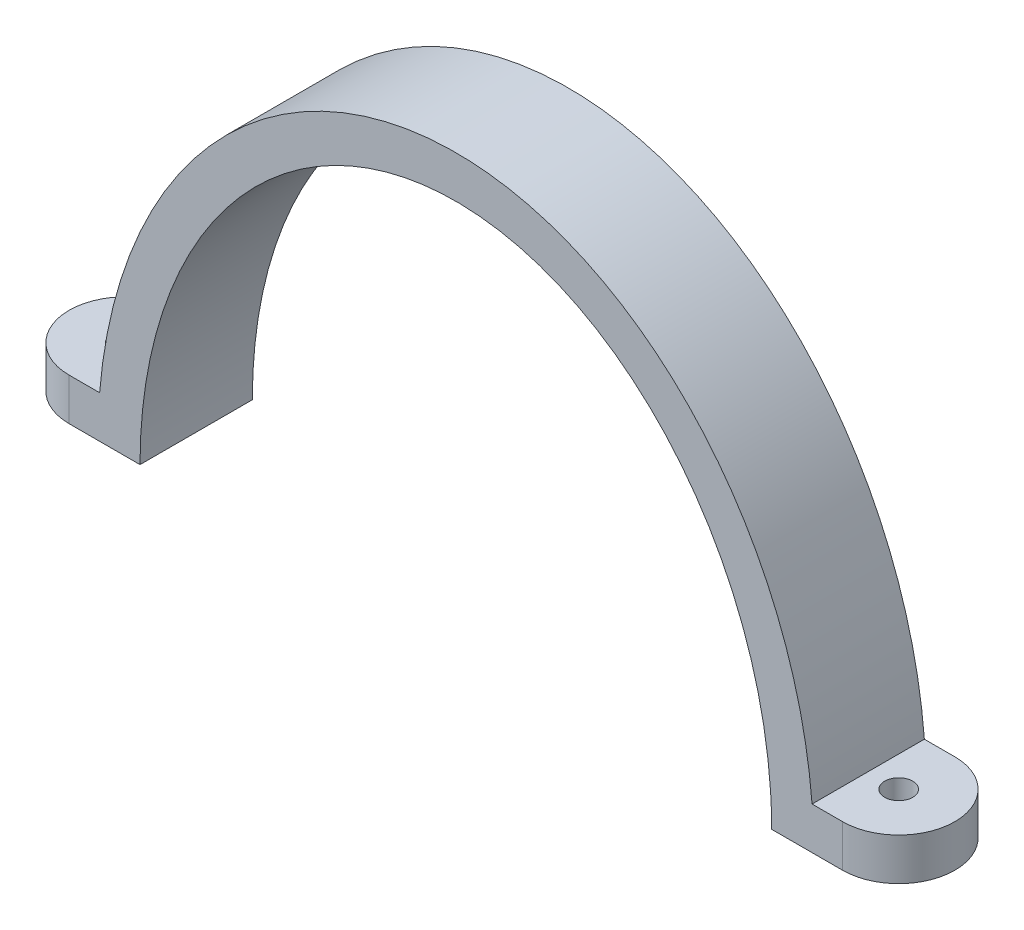
ISO-10303-21;
HEADER;
FILE_DESCRIPTION(('STEP AP214'),'2;1');
FILE_NAME('part.step','',(''),(''),'','','');
FILE_SCHEMA(('AUTOMOTIVE_DESIGN { 1 0 10303 214 1 1 1 1 }'));
ENDSEC;
DATA;
#1=APPLICATION_CONTEXT('core data for automotive mechanical design processes');
#2=APPLICATION_PROTOCOL_DEFINITION('international standard','automotive_design',2000,#1);
#3=PRODUCT_CONTEXT('',#1,'mechanical');
#4=PRODUCT('Part','Part','',(#3));
#5=PRODUCT_RELATED_PRODUCT_CATEGORY('part','',(#4));
#6=PRODUCT_DEFINITION_FORMATION('','',#4);
#7=PRODUCT_DEFINITION_CONTEXT('part definition',#1,'design');
#8=PRODUCT_DEFINITION('design','',#6,#7);
#9=PRODUCT_DEFINITION_SHAPE('','',#8);
#10=(LENGTH_UNIT() NAMED_UNIT(*) SI_UNIT(.MILLI.,.METRE.));
#11=(NAMED_UNIT(*) PLANE_ANGLE_UNIT() SI_UNIT($,.RADIAN.));
#12=(NAMED_UNIT(*) SI_UNIT($,.STERADIAN.) SOLID_ANGLE_UNIT());
#13=UNCERTAINTY_MEASURE_WITH_UNIT(LENGTH_MEASURE(1.E-05),#10,'distance_accuracy_value','');
#14=(GEOMETRIC_REPRESENTATION_CONTEXT(3) GLOBAL_UNCERTAINTY_ASSIGNED_CONTEXT((#13)) GLOBAL_UNIT_ASSIGNED_CONTEXT((#10,
#11,#12)) REPRESENTATION_CONTEXT('',''));
#15=CARTESIAN_POINT('',(0.,0.,0.));
#16=DIRECTION('',(0.,0.,1.));
#17=DIRECTION('',(1.,0.,0.));
#18=AXIS2_PLACEMENT_3D('',#15,#16,#17);
#19=CARTESIAN_POINT('',(0.,3.,0.));
#20=DIRECTION('',(0.,1.,0.));
#21=DIRECTION('',(0.,0.,1.));
#22=AXIS2_PLACEMENT_3D('',#19,#20,#21);
#23=PLANE('',#22);
#24=CARTESIAN_POINT('',(0.,3.,0.));
#25=DIRECTION('',(0.,1.,0.));
#26=DIRECTION('',(0.,0.,1.));
#27=AXIS2_PLACEMENT_3D('',#24,#25,#26);
#28=CIRCLE('',#27,1.);
#29=CARTESIAN_POINT('',(0.,3.,1.));
#30=VERTEX_POINT('',#29);
#31=EDGE_CURVE('E122',#30,#30,#28,.T.);
#32=ORIENTED_EDGE('',*,*,#31,.F.);
#33=EDGE_LOOP('',(#32));
#34=FACE_BOUND('',#33,.T.);
#35=DIRECTION('',(1.,0.,0.));
#36=VECTOR('',#35,1.);
#37=CARTESIAN_POINT('',(0.,3.,4.));
#38=LINE('',#37,#36);
#39=CARTESIAN_POINT('',(0.,3.,4.));
#40=VERTEX_POINT('',#39);
#41=CARTESIAN_POINT('',(2.17365374591523,3.,4.));
#42=VERTEX_POINT('',#41);
#43=EDGE_CURVE('E101',#40,#42,#38,.T.);
#44=ORIENTED_EDGE('',*,*,#43,.T.);
#45=DIRECTION('',(0.,0.,-1.));
#46=VECTOR('',#45,1.);
#47=CARTESIAN_POINT('',(2.17365374591523,3.,4.));
#48=LINE('',#47,#46);
#49=CARTESIAN_POINT('',(2.17365374591523,3.,-4.));
#50=VERTEX_POINT('',#49);
#51=EDGE_CURVE('E133',#42,#50,#48,.T.);
#52=ORIENTED_EDGE('',*,*,#51,.T.);
#53=DIRECTION('',(-1.,0.,0.));
#54=VECTOR('',#53,1.);
#55=CARTESIAN_POINT('',(5.,3.,-4.));
#56=LINE('',#55,#54);
#57=CARTESIAN_POINT('',(0.,3.,-4.));
#58=VERTEX_POINT('',#57);
#59=EDGE_CURVE('E110',#50,#58,#56,.T.);
#60=ORIENTED_EDGE('',*,*,#59,.T.);
#61=CARTESIAN_POINT('',(0.,3.,0.));
#62=DIRECTION('',(0.,1.,0.));
#63=DIRECTION('',(0.,0.,1.));
#64=AXIS2_PLACEMENT_3D('',#61,#62,#63);
#65=CIRCLE('',#64,4.);
#66=EDGE_CURVE('E70',#58,#40,#65,.T.);
#67=ORIENTED_EDGE('',*,*,#66,.T.);
#68=EDGE_LOOP('',(#44,#52,#60,#67));
#69=FACE_BOUND('',#68,.T.);
#70=ADVANCED_FACE('F45',(#34,#69),#23,.T.);
#71=CARTESIAN_POINT('',(0.,0.,0.));
#72=DIRECTION('',(0.,1.,0.));
#73=DIRECTION('',(0.,0.,1.));
#74=AXIS2_PLACEMENT_3D('',#71,#72,#73);
#75=PLANE('',#74);
#76=DIRECTION('',(0.,0.,-1.));
#77=VECTOR('',#76,1.);
#78=CARTESIAN_POINT('',(5.05000000000001,0.,4.));
#79=LINE('',#78,#77);
#80=CARTESIAN_POINT('',(5.05000000000001,0.,4.));
#81=VERTEX_POINT('',#80);
#82=CARTESIAN_POINT('',(5.05000000000001,0.,-4.));
#83=VERTEX_POINT('',#82);
#84=EDGE_CURVE('E107',#81,#83,#79,.T.);
#85=ORIENTED_EDGE('',*,*,#84,.F.);
#86=DIRECTION('',(1.,0.,0.));
#87=VECTOR('',#86,1.);
#88=CARTESIAN_POINT('',(0.,0.,4.));
#89=LINE('',#88,#87);
#90=CARTESIAN_POINT('',(0.,0.,4.));
#91=VERTEX_POINT('',#90);
#92=EDGE_CURVE('E93',#91,#81,#89,.T.);
#93=ORIENTED_EDGE('',*,*,#92,.F.);
#94=CARTESIAN_POINT('',(0.,0.,0.));
#95=DIRECTION('',(0.,1.,0.));
#96=DIRECTION('',(0.,0.,1.));
#97=AXIS2_PLACEMENT_3D('',#94,#95,#96);
#98=CIRCLE('',#97,4.);
#99=CARTESIAN_POINT('',(0.,0.,-4.));
#100=VERTEX_POINT('',#99);
#101=EDGE_CURVE('E83',#100,#91,#98,.T.);
#102=ORIENTED_EDGE('',*,*,#101,.F.);
#103=DIRECTION('',(-1.,0.,0.));
#104=VECTOR('',#103,1.);
#105=CARTESIAN_POINT('',(5.,0.,-4.));
#106=LINE('',#105,#104);
#107=EDGE_CURVE('E94',#83,#100,#106,.T.);
#108=ORIENTED_EDGE('',*,*,#107,.F.);
#109=EDGE_LOOP('',(#85,#93,#102,#108));
#110=FACE_BOUND('',#109,.T.);
#111=CARTESIAN_POINT('',(0.,0.,0.));
#112=DIRECTION('',(0.,1.,0.));
#113=DIRECTION('',(0.,0.,1.));
#114=AXIS2_PLACEMENT_3D('',#111,#112,#113);
#115=CIRCLE('',#114,1.);
#116=CARTESIAN_POINT('',(0.,0.,1.));
#117=VERTEX_POINT('',#116);
#118=EDGE_CURVE('E127',#117,#117,#115,.T.);
#119=ORIENTED_EDGE('',*,*,#118,.T.);
#120=EDGE_LOOP('',(#119));
#121=FACE_BOUND('',#120,.T.);
#122=ADVANCED_FACE('F104',(#110,#121),#75,.F.);
#123=CARTESIAN_POINT('',(5.,3.,-4.));
#124=DIRECTION('',(0.,0.,1.));
#125=DIRECTION('',(1.,0.,0.));
#126=AXIS2_PLACEMENT_3D('',#123,#124,#125);
#127=PLANE('',#126);
#128=CARTESIAN_POINT('',(27.55,0.,-4.));
#129=DIRECTION('',(0.,0.,1.));
#130=DIRECTION('',(0.,1.,0.));
#131=AXIS2_PLACEMENT_3D('',#128,#129,#130);
#132=ELLIPSE('',#131,30.5,25.5);
#133=CARTESIAN_POINT('',(52.9263462540848,3.,-4.));
#134=VERTEX_POINT('',#133);
#135=EDGE_CURVE('E154',#134,#50,#132,.T.);
#136=ORIENTED_EDGE('',*,*,#135,.F.);
#137=DIRECTION('',(-1.,0.,0.));
#138=VECTOR('',#137,1.);
#139=CARTESIAN_POINT('',(50.1,3.,-4.));
#140=LINE('',#139,#138);
#141=CARTESIAN_POINT('',(55.1,3.,-4.));
#142=VERTEX_POINT('',#141);
#143=EDGE_CURVE('E202',#142,#134,#140,.T.);
#144=ORIENTED_EDGE('',*,*,#143,.F.);
#145=DIRECTION('',(0.,-1.,0.));
#146=VECTOR('',#145,1.);
#147=CARTESIAN_POINT('',(55.1,3.,-4.));
#148=LINE('',#147,#146);
#149=CARTESIAN_POINT('',(55.1,0.,-4.));
#150=VERTEX_POINT('',#149);
#151=EDGE_CURVE('E237',#142,#150,#148,.T.);
#152=ORIENTED_EDGE('',*,*,#151,.T.);
#153=DIRECTION('',(1.,0.,0.));
#154=VECTOR('',#153,1.);
#155=CARTESIAN_POINT('',(50.05,0.,-4.));
#156=LINE('',#155,#154);
#157=CARTESIAN_POINT('',(50.05,0.,-4.));
#158=VERTEX_POINT('',#157);
#159=EDGE_CURVE('E145',#158,#150,#156,.T.);
#160=ORIENTED_EDGE('',*,*,#159,.F.);
#161=CARTESIAN_POINT('',(27.55,0.,-4.));
#162=DIRECTION('',(0.,0.,-1.));
#163=DIRECTION('',(0.,1.,0.));
#164=AXIS2_PLACEMENT_3D('',#161,#162,#163);
#165=ELLIPSE('',#164,27.5,22.5);
#166=EDGE_CURVE('E150',#83,#158,#165,.T.);
#167=ORIENTED_EDGE('',*,*,#166,.F.);
#168=ORIENTED_EDGE('',*,*,#107,.T.);
#169=DIRECTION('',(0.,-1.,0.));
#170=VECTOR('',#169,1.);
#171=CARTESIAN_POINT('',(0.,3.,-4.));
#172=LINE('',#171,#170);
#173=EDGE_CURVE('E54',#58,#100,#172,.T.);
#174=ORIENTED_EDGE('',*,*,#173,.F.);
#175=ORIENTED_EDGE('',*,*,#59,.F.);
#176=EDGE_LOOP('',(#136,#144,#152,#160,#167,#168,#174,#175));
#177=FACE_BOUND('',#176,.T.);
#178=ADVANCED_FACE('F47',(#177),#127,.F.);
#179=CARTESIAN_POINT('',(0.,3.,0.));
#180=DIRECTION('',(0.,-1.,0.));
#181=DIRECTION('',(0.,0.,-1.));
#182=AXIS2_PLACEMENT_3D('',#179,#180,#181);
#183=CYLINDRICAL_SURFACE('',#182,4.);
#184=ORIENTED_EDGE('',*,*,#101,.T.);
#185=DIRECTION('',(0.,-1.,0.));
#186=VECTOR('',#185,1.);
#187=CARTESIAN_POINT('',(0.,3.,4.));
#188=LINE('',#187,#186);
#189=EDGE_CURVE('E86',#40,#91,#188,.T.);
#190=ORIENTED_EDGE('',*,*,#189,.F.);
#191=ORIENTED_EDGE('',*,*,#66,.F.);
#192=ORIENTED_EDGE('',*,*,#173,.T.);
#193=EDGE_LOOP('',(#184,#190,#191,#192));
#194=FACE_BOUND('',#193,.T.);
#195=ADVANCED_FACE('F85',(#194),#183,.T.);
#196=CARTESIAN_POINT('',(0.,3.,4.));
#197=DIRECTION('',(0.,0.,-1.));
#198=DIRECTION('',(-1.,0.,0.));
#199=AXIS2_PLACEMENT_3D('',#196,#197,#198);
#200=PLANE('',#199);
#201=DIRECTION('',(1.,0.,0.));
#202=VECTOR('',#201,1.);
#203=CARTESIAN_POINT('',(55.1,3.,4.));
#204=LINE('',#203,#202);
#205=CARTESIAN_POINT('',(52.9263462540848,3.,4.));
#206=VERTEX_POINT('',#205);
#207=CARTESIAN_POINT('',(55.1,3.,4.));
#208=VERTEX_POINT('',#207);
#209=EDGE_CURVE('E61',#206,#208,#204,.T.);
#210=ORIENTED_EDGE('',*,*,#209,.F.);
#211=CARTESIAN_POINT('',(27.55,0.,4.));
#212=DIRECTION('',(0.,0.,1.));
#213=DIRECTION('',(0.,1.,0.));
#214=AXIS2_PLACEMENT_3D('',#211,#212,#213);
#215=ELLIPSE('',#214,30.5,25.5);
#216=EDGE_CURVE('E149',#206,#42,#215,.T.);
#217=ORIENTED_EDGE('',*,*,#216,.T.);
#218=ORIENTED_EDGE('',*,*,#43,.F.);
#219=ORIENTED_EDGE('',*,*,#189,.T.);
#220=ORIENTED_EDGE('',*,*,#92,.T.);
#221=CARTESIAN_POINT('',(27.55,0.,4.));
#222=DIRECTION('',(0.,0.,-1.));
#223=DIRECTION('',(0.,1.,0.));
#224=AXIS2_PLACEMENT_3D('',#221,#222,#223);
#225=ELLIPSE('',#224,27.5,22.5);
#226=CARTESIAN_POINT('',(50.05,0.,4.));
#227=VERTEX_POINT('',#226);
#228=EDGE_CURVE('E162',#81,#227,#225,.T.);
#229=ORIENTED_EDGE('',*,*,#228,.T.);
#230=DIRECTION('',(1.,0.,0.));
#231=VECTOR('',#230,1.);
#232=CARTESIAN_POINT('',(50.05,0.,4.));
#233=LINE('',#232,#231);
#234=CARTESIAN_POINT('',(55.1,0.,4.));
#235=VERTEX_POINT('',#234);
#236=EDGE_CURVE('E144',#227,#235,#233,.T.);
#237=ORIENTED_EDGE('',*,*,#236,.T.);
#238=DIRECTION('',(0.,-1.,0.));
#239=VECTOR('',#238,1.);
#240=CARTESIAN_POINT('',(55.1,3.,4.));
#241=LINE('',#240,#239);
#242=EDGE_CURVE('E225',#208,#235,#241,.T.);
#243=ORIENTED_EDGE('',*,*,#242,.F.);
#244=EDGE_LOOP('',(#210,#217,#218,#219,#220,#229,#237,#243));
#245=FACE_BOUND('',#244,.T.);
#246=ADVANCED_FACE('F97',(#245),#200,.F.);
#247=CARTESIAN_POINT('',(0.,3.,0.));
#248=DIRECTION('',(0.,-1.,0.));
#249=DIRECTION('',(0.,0.,-1.));
#250=AXIS2_PLACEMENT_3D('',#247,#248,#249);
#251=CYLINDRICAL_SURFACE('',#250,1.);
#252=ORIENTED_EDGE('',*,*,#31,.T.);
#253=EDGE_LOOP('',(#252));
#254=FACE_BOUND('',#253,.T.);
#255=ORIENTED_EDGE('',*,*,#118,.F.);
#256=EDGE_LOOP('',(#255));
#257=FACE_BOUND('',#256,.T.);
#258=ADVANCED_FACE('F179',(#254,#257),#251,.F.);
#259=DIRECTION('',(0.,0.,-1.));
#260=VECTOR('',#259,1.);
#261=SURFACE_OF_LINEAR_EXTRUSION('',#215,#260);
#262=ORIENTED_EDGE('',*,*,#216,.F.);
#263=DIRECTION('',(0.,0.,-1.));
#264=VECTOR('',#263,1.);
#265=CARTESIAN_POINT('',(52.9263462540848,3.,4.));
#266=LINE('',#265,#264);
#267=EDGE_CURVE('E11',#206,#134,#266,.T.);
#268=ORIENTED_EDGE('',*,*,#267,.T.);
#269=ORIENTED_EDGE('',*,*,#135,.T.);
#270=ORIENTED_EDGE('',*,*,#51,.F.);
#271=EDGE_LOOP('',(#262,#268,#269,#270));
#272=FACE_BOUND('',#271,.T.);
#273=ADVANCED_FACE('F174',(#272),#261,.F.);
#274=DIRECTION('',(0.,0.,-1.));
#275=VECTOR('',#274,1.);
#276=SURFACE_OF_LINEAR_EXTRUSION('',#225,#275);
#277=ORIENTED_EDGE('',*,*,#166,.T.);
#278=DIRECTION('',(0.,0.,-1.));
#279=VECTOR('',#278,1.);
#280=CARTESIAN_POINT('',(50.05,0.,4.));
#281=LINE('',#280,#279);
#282=EDGE_CURVE('E140',#227,#158,#281,.T.);
#283=ORIENTED_EDGE('',*,*,#282,.F.);
#284=ORIENTED_EDGE('',*,*,#228,.F.);
#285=ORIENTED_EDGE('',*,*,#84,.T.);
#286=EDGE_LOOP('',(#277,#283,#284,#285));
#287=FACE_BOUND('',#286,.T.);
#288=ADVANCED_FACE('F169',(#287),#276,.F.);
#289=CARTESIAN_POINT('',(50.05,0.,4.));
#290=DIRECTION('',(0.,1.,0.));
#291=DIRECTION('',(-1.,0.,0.));
#292=AXIS2_PLACEMENT_3D('',#289,#290,#291);
#293=PLANE('',#292);
#294=CARTESIAN_POINT('',(55.1,0.,0.));
#295=DIRECTION('',(0.,1.,0.));
#296=DIRECTION('',(0.,0.,1.));
#297=AXIS2_PLACEMENT_3D('',#294,#295,#296);
#298=CIRCLE('',#297,4.);
#299=EDGE_CURVE('E234',#235,#150,#298,.T.);
#300=ORIENTED_EDGE('',*,*,#299,.F.);
#301=ORIENTED_EDGE('',*,*,#236,.F.);
#302=ORIENTED_EDGE('',*,*,#282,.T.);
#303=ORIENTED_EDGE('',*,*,#159,.T.);
#304=EDGE_LOOP('',(#300,#301,#302,#303));
#305=FACE_BOUND('',#304,.T.);
#306=CARTESIAN_POINT('',(55.1,0.,0.));
#307=DIRECTION('',(0.,1.,0.));
#308=DIRECTION('',(0.,0.,1.));
#309=AXIS2_PLACEMENT_3D('',#306,#307,#308);
#310=CIRCLE('',#309,0.999999999999998);
#311=CARTESIAN_POINT('',(55.1,0.,0.999999999999998));
#312=VERTEX_POINT('',#311);
#313=EDGE_CURVE('E158',#312,#312,#310,.T.);
#314=ORIENTED_EDGE('',*,*,#313,.T.);
#315=EDGE_LOOP('',(#314));
#316=FACE_BOUND('',#315,.T.);
#317=ADVANCED_FACE('F173',(#305,#316),#293,.F.);
#318=CARTESIAN_POINT('',(55.1,3.,0.));
#319=DIRECTION('',(0.,1.,0.));
#320=DIRECTION('',(0.,0.,1.));
#321=AXIS2_PLACEMENT_3D('',#318,#319,#320);
#322=PLANE('',#321);
#323=CARTESIAN_POINT('',(55.1,3.,0.));
#324=DIRECTION('',(0.,1.,0.));
#325=DIRECTION('',(0.,0.,1.));
#326=AXIS2_PLACEMENT_3D('',#323,#324,#325);
#327=CIRCLE('',#326,0.999999999999998);
#328=CARTESIAN_POINT('',(55.1,3.,0.999999999999998));
#329=VERTEX_POINT('',#328);
#330=EDGE_CURVE('E242',#329,#329,#327,.T.);
#331=ORIENTED_EDGE('',*,*,#330,.F.);
#332=EDGE_LOOP('',(#331));
#333=FACE_BOUND('',#332,.T.);
#334=ORIENTED_EDGE('',*,*,#267,.F.);
#335=ORIENTED_EDGE('',*,*,#209,.T.);
#336=CARTESIAN_POINT('',(55.1,3.,0.));
#337=DIRECTION('',(0.,1.,0.));
#338=DIRECTION('',(0.,0.,1.));
#339=AXIS2_PLACEMENT_3D('',#336,#337,#338);
#340=CIRCLE('',#339,4.);
#341=EDGE_CURVE('E235',#208,#142,#340,.T.);
#342=ORIENTED_EDGE('',*,*,#341,.T.);
#343=ORIENTED_EDGE('',*,*,#143,.T.);
#344=EDGE_LOOP('',(#334,#335,#342,#343));
#345=FACE_BOUND('',#344,.T.);
#346=ADVANCED_FACE('F264',(#333,#345),#322,.T.);
#347=CARTESIAN_POINT('',(55.1,3.,0.));
#348=DIRECTION('',(0.,-1.,0.));
#349=DIRECTION('',(0.,0.,-1.));
#350=AXIS2_PLACEMENT_3D('',#347,#348,#349);
#351=CYLINDRICAL_SURFACE('',#350,4.);
#352=ORIENTED_EDGE('',*,*,#299,.T.);
#353=ORIENTED_EDGE('',*,*,#151,.F.);
#354=ORIENTED_EDGE('',*,*,#341,.F.);
#355=ORIENTED_EDGE('',*,*,#242,.T.);
#356=EDGE_LOOP('',(#352,#353,#354,#355));
#357=FACE_BOUND('',#356,.T.);
#358=ADVANCED_FACE('F232',(#357),#351,.T.);
#359=CARTESIAN_POINT('',(55.1,3.,0.));
#360=DIRECTION('',(0.,-1.,0.));
#361=DIRECTION('',(0.,0.,-1.));
#362=AXIS2_PLACEMENT_3D('',#359,#360,#361);
#363=CYLINDRICAL_SURFACE('',#362,0.999999999999998);
#364=ORIENTED_EDGE('',*,*,#330,.T.);
#365=EDGE_LOOP('',(#364));
#366=FACE_BOUND('',#365,.T.);
#367=ORIENTED_EDGE('',*,*,#313,.F.);
#368=EDGE_LOOP('',(#367));
#369=FACE_BOUND('',#368,.T.);
#370=ADVANCED_FACE('F258',(#366,#369),#363,.F.);
#371=CLOSED_SHELL('',(#70,#122,#178,#195,#246,#258,#273,#288,#317,#346,#358,#370));
#372=MANIFOLD_SOLID_BREP('B2',#371);
#373=ADVANCED_BREP_SHAPE_REPRESENTATION('',(#18,#372),#14);
#374=SHAPE_DEFINITION_REPRESENTATION(#9,#373);
ENDSEC;
END-ISO-10303-21;
